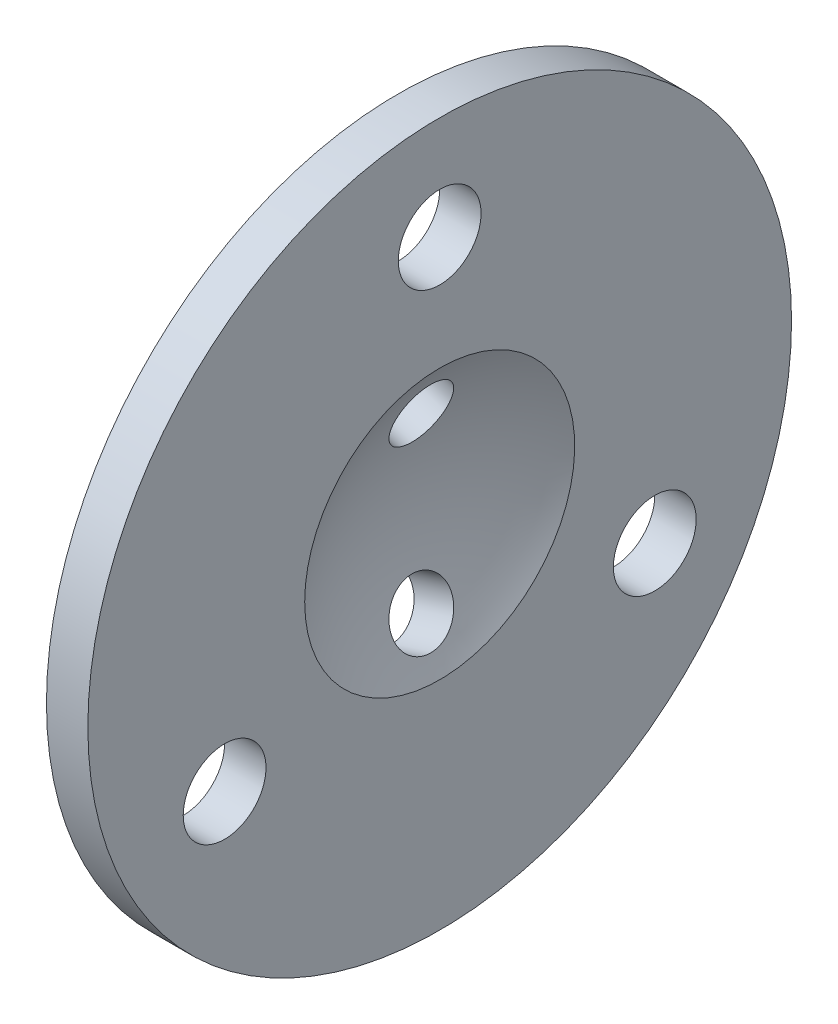
ISO-10303-21;
HEADER;
FILE_DESCRIPTION(('STEP AP214'),'2;1');
FILE_NAME('part.step','',(''),(''),'','','');
FILE_SCHEMA(('AUTOMOTIVE_DESIGN { 1 0 10303 214 1 1 1 1 }'));
ENDSEC;
DATA;
#1=APPLICATION_CONTEXT('core data for automotive mechanical design processes');
#2=APPLICATION_PROTOCOL_DEFINITION('international standard','automotive_design',2000,#1);
#3=PRODUCT_CONTEXT('',#1,'mechanical');
#4=PRODUCT('Part','Part','',(#3));
#5=PRODUCT_RELATED_PRODUCT_CATEGORY('part','',(#4));
#6=PRODUCT_DEFINITION_FORMATION('','',#4);
#7=PRODUCT_DEFINITION_CONTEXT('part definition',#1,'design');
#8=PRODUCT_DEFINITION('design','',#6,#7);
#9=PRODUCT_DEFINITION_SHAPE('','',#8);
#10=(LENGTH_UNIT() NAMED_UNIT(*) SI_UNIT(.MILLI.,.METRE.));
#11=(NAMED_UNIT(*) PLANE_ANGLE_UNIT() SI_UNIT($,.RADIAN.));
#12=(NAMED_UNIT(*) SI_UNIT($,.STERADIAN.) SOLID_ANGLE_UNIT());
#13=UNCERTAINTY_MEASURE_WITH_UNIT(LENGTH_MEASURE(1.E-05),#10,'distance_accuracy_value','');
#14=(GEOMETRIC_REPRESENTATION_CONTEXT(3) GLOBAL_UNCERTAINTY_ASSIGNED_CONTEXT((#13)) GLOBAL_UNIT_ASSIGNED_CONTEXT((#10,
#11,#12)) REPRESENTATION_CONTEXT('',''));
#15=CARTESIAN_POINT('',(0.,0.,0.));
#16=DIRECTION('',(0.,0.,1.));
#17=DIRECTION('',(1.,0.,0.));
#18=AXIS2_PLACEMENT_3D('',#15,#16,#17);
#19=CARTESIAN_POINT('',(0.,0.,0.));
#20=DIRECTION('',(-1.,0.,0.));
#21=DIRECTION('',(0.,1.,0.));
#22=AXIS2_PLACEMENT_3D('',#19,#20,#21);
#23=SPHERICAL_SURFACE('',#22,16.);
#24=CARTESIAN_POINT('',(-15.1922649930537,-4.79010275263843,0.));
#25=DIRECTION('',(0.953716950748227,0.300705799504274,0.));
#26=DIRECTION('',(-0.300705799504274,0.953716950748227,0.));
#27=AXIS2_PLACEMENT_3D('',#24,#25,#26);
#28=CIRCLE('',#27,1.5);
#29=CARTESIAN_POINT('',(-15.6433236923101,-3.35952732651609,0.));
#30=VERTEX_POINT('',#29);
#31=EDGE_CURVE('E63',#30,#30,#28,.T.);
#32=ORIENTED_EDGE('',*,*,#31,.T.);
#33=EDGE_LOOP('',(#32));
#34=FACE_BOUND('',#33,.T.);
#35=CARTESIAN_POINT('',(-15.1922649930537,4.79010275263843,0.));
#36=DIRECTION('',(0.953716950748227,-0.300705799504274,0.));
#37=DIRECTION('',(0.300705799504274,0.953716950748227,0.));
#38=AXIS2_PLACEMENT_3D('',#35,#36,#37);
#39=CIRCLE('',#38,1.5);
#40=CARTESIAN_POINT('',(-14.7412062937973,6.22067817876077,0.));
#41=VERTEX_POINT('',#40);
#42=EDGE_CURVE('E62',#41,#41,#39,.T.);
#43=ORIENTED_EDGE('',*,*,#42,.T.);
#44=EDGE_LOOP('',(#43));
#45=FACE_BOUND('',#44,.T.);
#46=CARTESIAN_POINT('',(-14.3874945699382,0.,0.));
#47=DIRECTION('',(-1.,0.,0.));
#48=DIRECTION('',(0.,0.,1.));
#49=AXIS2_PLACEMENT_3D('',#46,#47,#48);
#50=CIRCLE('',#49,7.);
#51=CARTESIAN_POINT('',(-14.3874945699382,0.,7.));
#52=VERTEX_POINT('',#51);
#53=EDGE_CURVE('E70',#52,#52,#50,.T.);
#54=ORIENTED_EDGE('',*,*,#53,.T.);
#55=EDGE_LOOP('',(#54));
#56=FACE_BOUND('',#55,.T.);
#57=ADVANCED_FACE('F41',(#34,#45,#56),#23,.T.);
#58=CARTESIAN_POINT('',(0.,0.,0.));
#59=DIRECTION('',(-1.,0.,0.));
#60=DIRECTION('',(0.,1.,0.));
#61=AXIS2_PLACEMENT_3D('',#58,#59,#60);
#62=SPHERICAL_SURFACE('',#61,14.);
#63=CARTESIAN_POINT('',(-13.2751781265072,-4.18564758544051,0.));
#64=DIRECTION('',(0.953716950748227,0.300705799504274,0.));
#65=DIRECTION('',(-0.300705799504274,0.953716950748227,0.));
#66=AXIS2_PLACEMENT_3D('',#63,#64,#65);
#67=CIRCLE('',#66,1.5);
#68=CARTESIAN_POINT('',(-13.7262368257636,-2.75507215931817,0.));
#69=VERTEX_POINT('',#68);
#70=EDGE_CURVE('E44',#69,#69,#67,.F.);
#71=ORIENTED_EDGE('',*,*,#70,.T.);
#72=EDGE_LOOP('',(#71));
#73=FACE_BOUND('',#72,.T.);
#74=CARTESIAN_POINT('',(-13.2751781265072,4.18564758544051,0.));
#75=DIRECTION('',(0.953716950748227,-0.300705799504274,0.));
#76=DIRECTION('',(0.300705799504274,0.953716950748227,0.));
#77=AXIS2_PLACEMENT_3D('',#74,#75,#76);
#78=CIRCLE('',#77,1.5);
#79=CARTESIAN_POINT('',(-12.8241194272508,5.61622301156285,0.));
#80=VERTEX_POINT('',#79);
#81=EDGE_CURVE('E59',#80,#80,#78,.F.);
#82=ORIENTED_EDGE('',*,*,#81,.T.);
#83=EDGE_LOOP('',(#82));
#84=FACE_BOUND('',#83,.T.);
#85=CARTESIAN_POINT('',(-12.3874945699382,0.,0.));
#86=DIRECTION('',(-1.,0.,0.));
#87=DIRECTION('',(0.,0.,1.));
#88=AXIS2_PLACEMENT_3D('',#85,#86,#87);
#89=CIRCLE('',#88,6.52303443803209);
#90=CARTESIAN_POINT('',(-12.3874945699382,0.,6.52303443803209));
#91=VERTEX_POINT('',#90);
#92=EDGE_CURVE('E10',#91,#91,#89,.T.);
#93=ORIENTED_EDGE('',*,*,#92,.F.);
#94=EDGE_LOOP('',(#93));
#95=FACE_BOUND('',#94,.T.);
#96=ADVANCED_FACE('F100',(#73,#84,#95),#62,.F.);
#97=CARTESIAN_POINT('',(-12.3874945699382,17.,0.));
#98=DIRECTION('',(-1.,0.,0.));
#99=DIRECTION('',(0.,0.,1.));
#100=AXIS2_PLACEMENT_3D('',#97,#98,#99);
#101=PLANE('',#100);
#102=CARTESIAN_POINT('',(-12.3874945699382,-6.00000000000045,-10.3923048454125));
#103=DIRECTION('',(-1.,0.,0.));
#104=DIRECTION('',(0.,0.,1.));
#105=AXIS2_PLACEMENT_3D('',#102,#103,#104);
#106=CIRCLE('',#105,2.00000000000097);
#107=CARTESIAN_POINT('',(-12.3874945699382,-6.00000000000045,-8.39230484541152));
#108=VERTEX_POINT('',#107);
#109=EDGE_CURVE('E150',#108,#108,#106,.T.);
#110=ORIENTED_EDGE('',*,*,#109,.T.);
#111=EDGE_LOOP('',(#110));
#112=FACE_BOUND('',#111,.T.);
#113=CARTESIAN_POINT('',(-12.3874945699382,-5.99999999999956,10.392304845414));
#114=DIRECTION('',(-1.,0.,0.));
#115=DIRECTION('',(0.,0.,1.));
#116=AXIS2_PLACEMENT_3D('',#113,#114,#115);
#117=CIRCLE('',#116,2.00000000000066);
#118=CARTESIAN_POINT('',(-12.3874945699382,-5.99999999999956,12.3923048454147));
#119=VERTEX_POINT('',#118);
#120=EDGE_CURVE('E158',#119,#119,#117,.T.);
#121=ORIENTED_EDGE('',*,*,#120,.T.);
#122=EDGE_LOOP('',(#121));
#123=FACE_BOUND('',#122,.T.);
#124=CARTESIAN_POINT('',(-12.3874945699382,12.,0.));
#125=DIRECTION('',(-1.,0.,0.));
#126=DIRECTION('',(0.,0.,1.));
#127=AXIS2_PLACEMENT_3D('',#124,#125,#126);
#128=CIRCLE('',#127,2.);
#129=CARTESIAN_POINT('',(-12.3874945699382,12.,2.));
#130=VERTEX_POINT('',#129);
#131=EDGE_CURVE('E79',#130,#130,#128,.T.);
#132=ORIENTED_EDGE('',*,*,#131,.T.);
#133=EDGE_LOOP('',(#132));
#134=FACE_BOUND('',#133,.T.);
#135=CARTESIAN_POINT('',(-12.3874945699382,0.,0.));
#136=DIRECTION('',(-1.,0.,0.));
#137=DIRECTION('',(0.,0.,1.));
#138=AXIS2_PLACEMENT_3D('',#135,#136,#137);
#139=CIRCLE('',#138,17.);
#140=CARTESIAN_POINT('',(-12.3874945699382,0.,17.));
#141=VERTEX_POINT('',#140);
#142=EDGE_CURVE('E49',#141,#141,#139,.T.);
#143=ORIENTED_EDGE('',*,*,#142,.F.);
#144=EDGE_LOOP('',(#143));
#145=FACE_BOUND('',#144,.T.);
#146=ORIENTED_EDGE('',*,*,#92,.T.);
#147=EDGE_LOOP('',(#146));
#148=FACE_BOUND('',#147,.T.);
#149=ADVANCED_FACE('F95',(#112,#123,#134,#145,#148),#101,.F.);
#150=CARTESIAN_POINT('',(-26.155193713551,0.,0.));
#151=DIRECTION('',(-1.,0.,0.));
#152=DIRECTION('',(0.,0.,1.));
#153=AXIS2_PLACEMENT_3D('',#150,#151,#152);
#154=CYLINDRICAL_SURFACE('',#153,17.);
#155=CARTESIAN_POINT('',(-14.3874945699382,0.,0.));
#156=DIRECTION('',(-1.,0.,0.));
#157=DIRECTION('',(0.,0.,1.));
#158=AXIS2_PLACEMENT_3D('',#155,#156,#157);
#159=CIRCLE('',#158,17.);
#160=CARTESIAN_POINT('',(-14.3874945699382,0.,17.));
#161=VERTEX_POINT('',#160);
#162=EDGE_CURVE('E56',#161,#161,#159,.T.);
#163=ORIENTED_EDGE('',*,*,#162,.F.);
#164=EDGE_LOOP('',(#163));
#165=FACE_BOUND('',#164,.T.);
#166=ORIENTED_EDGE('',*,*,#142,.T.);
#167=EDGE_LOOP('',(#166));
#168=FACE_BOUND('',#167,.T.);
#169=ADVANCED_FACE('F92',(#165,#168),#154,.T.);
#170=CARTESIAN_POINT('',(-14.3874945699382,17.,0.));
#171=DIRECTION('',(1.,0.,0.));
#172=DIRECTION('',(0.,0.,-1.));
#173=AXIS2_PLACEMENT_3D('',#170,#171,#172);
#174=PLANE('',#173);
#175=CARTESIAN_POINT('',(-14.3874945699382,-6.00000000000045,-10.3923048454125));
#176=DIRECTION('',(-1.,0.,0.));
#177=DIRECTION('',(0.,0.,1.));
#178=AXIS2_PLACEMENT_3D('',#175,#176,#177);
#179=CIRCLE('',#178,2.00000000000097);
#180=CARTESIAN_POINT('',(-14.3874945699382,-6.00000000000045,-8.39230484541152));
#181=VERTEX_POINT('',#180);
#182=EDGE_CURVE('E148',#181,#181,#179,.T.);
#183=ORIENTED_EDGE('',*,*,#182,.F.);
#184=EDGE_LOOP('',(#183));
#185=FACE_BOUND('',#184,.T.);
#186=CARTESIAN_POINT('',(-14.3874945699382,-5.99999999999956,10.392304845414));
#187=DIRECTION('',(-1.,0.,0.));
#188=DIRECTION('',(0.,0.,1.));
#189=AXIS2_PLACEMENT_3D('',#186,#187,#188);
#190=CIRCLE('',#189,2.00000000000066);
#191=CARTESIAN_POINT('',(-14.3874945699382,-5.99999999999956,12.3923048454147));
#192=VERTEX_POINT('',#191);
#193=EDGE_CURVE('E152',#192,#192,#190,.T.);
#194=ORIENTED_EDGE('',*,*,#193,.F.);
#195=EDGE_LOOP('',(#194));
#196=FACE_BOUND('',#195,.T.);
#197=CARTESIAN_POINT('',(-14.3874945699382,12.,0.));
#198=DIRECTION('',(-1.,0.,0.));
#199=DIRECTION('',(0.,0.,1.));
#200=AXIS2_PLACEMENT_3D('',#197,#198,#199);
#201=CIRCLE('',#200,2.);
#202=CARTESIAN_POINT('',(-14.3874945699382,12.,2.));
#203=VERTEX_POINT('',#202);
#204=EDGE_CURVE('E164',#203,#203,#201,.T.);
#205=ORIENTED_EDGE('',*,*,#204,.F.);
#206=EDGE_LOOP('',(#205));
#207=FACE_BOUND('',#206,.T.);
#208=ORIENTED_EDGE('',*,*,#53,.F.);
#209=EDGE_LOOP('',(#208));
#210=FACE_BOUND('',#209,.T.);
#211=ORIENTED_EDGE('',*,*,#162,.T.);
#212=EDGE_LOOP('',(#211));
#213=FACE_BOUND('',#212,.T.);
#214=ADVANCED_FACE('F90',(#185,#196,#207,#210,#213),#174,.F.);
#215=CARTESIAN_POINT('',(0.,0.,0.));
#216=DIRECTION('',(0.953716950748227,-0.300705799504274,0.));
#217=DIRECTION('',(0.300705799504274,0.953716950748227,0.));
#218=AXIS2_PLACEMENT_3D('',#215,#216,#217);
#219=CYLINDRICAL_SURFACE('',#218,1.5);
#220=ORIENTED_EDGE('',*,*,#81,.F.);
#221=EDGE_LOOP('',(#220));
#222=FACE_BOUND('',#221,.T.);
#223=ORIENTED_EDGE('',*,*,#42,.F.);
#224=EDGE_LOOP('',(#223));
#225=FACE_BOUND('',#224,.T.);
#226=ADVANCED_FACE('F118',(#222,#225),#219,.F.);
#227=CARTESIAN_POINT('',(0.,0.,0.));
#228=DIRECTION('',(0.953716950748227,0.300705799504274,0.));
#229=DIRECTION('',(0.300705799504274,-0.953716950748227,0.));
#230=AXIS2_PLACEMENT_3D('',#227,#228,#229);
#231=CYLINDRICAL_SURFACE('',#230,1.5);
#232=ORIENTED_EDGE('',*,*,#70,.F.);
#233=EDGE_LOOP('',(#232));
#234=FACE_BOUND('',#233,.T.);
#235=ORIENTED_EDGE('',*,*,#31,.F.);
#236=EDGE_LOOP('',(#235));
#237=FACE_BOUND('',#236,.T.);
#238=ADVANCED_FACE('F124',(#234,#237),#231,.F.);
#239=CARTESIAN_POINT('',(-4.38749456993816,12.,0.));
#240=DIRECTION('',(-1.,0.,0.));
#241=DIRECTION('',(0.,0.,1.));
#242=AXIS2_PLACEMENT_3D('',#239,#240,#241);
#243=CYLINDRICAL_SURFACE('',#242,2.);
#244=ORIENTED_EDGE('',*,*,#204,.T.);
#245=EDGE_LOOP('',(#244));
#246=FACE_BOUND('',#245,.T.);
#247=ORIENTED_EDGE('',*,*,#131,.F.);
#248=EDGE_LOOP('',(#247));
#249=FACE_BOUND('',#248,.T.);
#250=ADVANCED_FACE('F132',(#246,#249),#243,.F.);
#251=CARTESIAN_POINT('',(-4.38749456993816,-5.99999999999956,10.392304845414));
#252=DIRECTION('',(-1.,0.,0.));
#253=DIRECTION('',(0.,0.,1.));
#254=AXIS2_PLACEMENT_3D('',#251,#252,#253);
#255=CYLINDRICAL_SURFACE('',#254,2.00000000000066);
#256=ORIENTED_EDGE('',*,*,#193,.T.);
#257=EDGE_LOOP('',(#256));
#258=FACE_BOUND('',#257,.T.);
#259=ORIENTED_EDGE('',*,*,#120,.F.);
#260=EDGE_LOOP('',(#259));
#261=FACE_BOUND('',#260,.T.);
#262=ADVANCED_FACE('F136',(#258,#261),#255,.F.);
#263=CARTESIAN_POINT('',(-4.38749456993816,-6.00000000000045,-10.3923048454125));
#264=DIRECTION('',(-1.,0.,0.));
#265=DIRECTION('',(0.,0.,1.));
#266=AXIS2_PLACEMENT_3D('',#263,#264,#265);
#267=CYLINDRICAL_SURFACE('',#266,2.00000000000097);
#268=ORIENTED_EDGE('',*,*,#182,.T.);
#269=EDGE_LOOP('',(#268));
#270=FACE_BOUND('',#269,.T.);
#271=ORIENTED_EDGE('',*,*,#109,.F.);
#272=EDGE_LOOP('',(#271));
#273=FACE_BOUND('',#272,.T.);
#274=ADVANCED_FACE('F140',(#270,#273),#267,.F.);
#275=CLOSED_SHELL('',(#57,#96,#149,#169,#214,#226,#238,#250,#262,#274));
#276=MANIFOLD_SOLID_BREP('B2',#275);
#277=ADVANCED_BREP_SHAPE_REPRESENTATION('',(#18,#276),#14);
#278=SHAPE_DEFINITION_REPRESENTATION(#9,#277);
ENDSEC;
END-ISO-10303-21;
